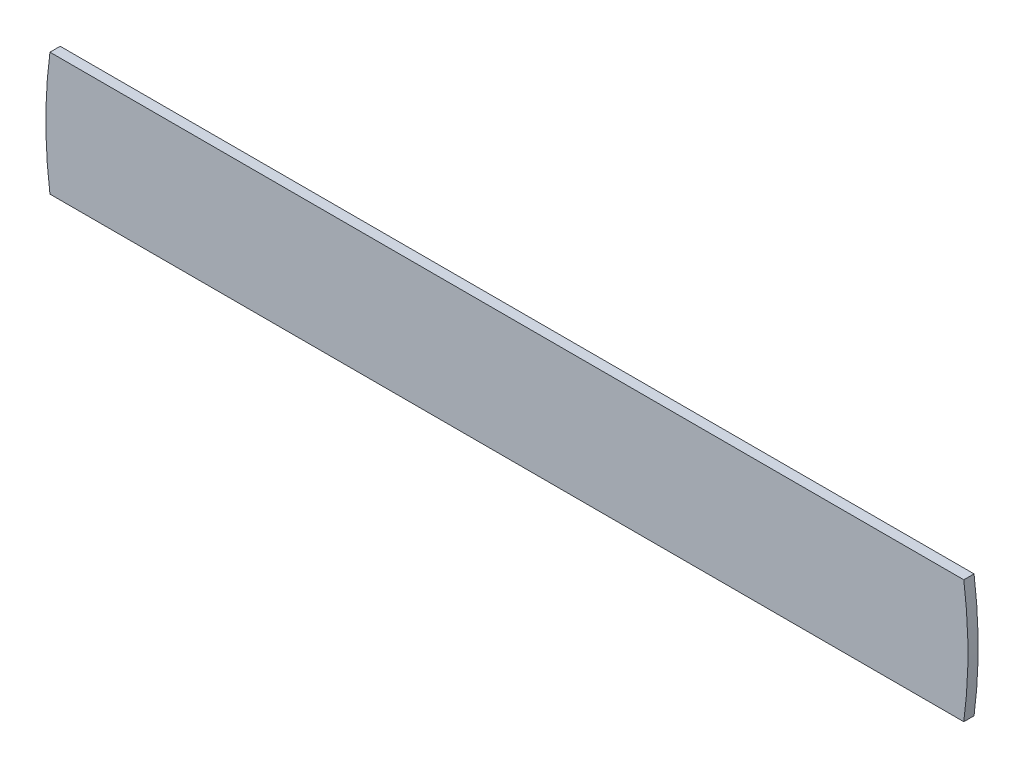
ISO-10303-21;
HEADER;
FILE_DESCRIPTION(('STEP AP214'),'2;1');
FILE_NAME('part.step','',(''),(''),'','','');
FILE_SCHEMA(('AUTOMOTIVE_DESIGN { 1 0 10303 214 1 1 1 1 }'));
ENDSEC;
DATA;
#1=APPLICATION_CONTEXT('core data for automotive mechanical design processes');
#2=APPLICATION_PROTOCOL_DEFINITION('international standard','automotive_design',2000,#1);
#3=PRODUCT_CONTEXT('',#1,'mechanical');
#4=PRODUCT('Part','Part','',(#3));
#5=PRODUCT_RELATED_PRODUCT_CATEGORY('part','',(#4));
#6=PRODUCT_DEFINITION_FORMATION('','',#4);
#7=PRODUCT_DEFINITION_CONTEXT('part definition',#1,'design');
#8=PRODUCT_DEFINITION('design','',#6,#7);
#9=PRODUCT_DEFINITION_SHAPE('','',#8);
#10=(LENGTH_UNIT() NAMED_UNIT(*) SI_UNIT(.MILLI.,.METRE.));
#11=(NAMED_UNIT(*) PLANE_ANGLE_UNIT() SI_UNIT($,.RADIAN.));
#12=(NAMED_UNIT(*) SI_UNIT($,.STERADIAN.) SOLID_ANGLE_UNIT());
#13=UNCERTAINTY_MEASURE_WITH_UNIT(LENGTH_MEASURE(1.E-05),#10,'distance_accuracy_value','');
#14=(GEOMETRIC_REPRESENTATION_CONTEXT(3) GLOBAL_UNCERTAINTY_ASSIGNED_CONTEXT((#13)) GLOBAL_UNIT_ASSIGNED_CONTEXT((#10,
#11,#12)) REPRESENTATION_CONTEXT('',''));
#15=CARTESIAN_POINT('',(0.,0.,0.));
#16=DIRECTION('',(0.,0.,1.));
#17=DIRECTION('',(1.,0.,0.));
#18=AXIS2_PLACEMENT_3D('',#15,#16,#17);
#19=CARTESIAN_POINT('',(0.,0.,-2.));
#20=DIRECTION('',(0.,0.,1.));
#21=DIRECTION('',(1.,0.,0.));
#22=AXIS2_PLACEMENT_3D('',#19,#20,#21);
#23=CYLINDRICAL_SURFACE('',#22,90.);
#24=CARTESIAN_POINT('',(0.,0.,0.));
#25=DIRECTION('',(0.,0.,1.));
#26=DIRECTION('',(1.,0.,0.));
#27=AXIS2_PLACEMENT_3D('',#24,#25,#26);
#28=CIRCLE('',#27,90.);
#29=CARTESIAN_POINT('',(89.196412483911,-12.,0.));
#30=VERTEX_POINT('',#29);
#31=CARTESIAN_POINT('',(89.196412483911,12.,0.));
#32=VERTEX_POINT('',#31);
#33=EDGE_CURVE('E110',#30,#32,#28,.T.);
#34=ORIENTED_EDGE('',*,*,#33,.F.);
#35=DIRECTION('',(0.,0.,1.));
#36=VECTOR('',#35,1.);
#37=CARTESIAN_POINT('',(89.196412483911,-12.,-2.));
#38=LINE('',#37,#36);
#39=CARTESIAN_POINT('',(89.196412483911,-12.,-2.));
#40=VERTEX_POINT('',#39);
#41=EDGE_CURVE('E11',#40,#30,#38,.T.);
#42=ORIENTED_EDGE('',*,*,#41,.F.);
#43=CARTESIAN_POINT('',(0.,0.,-2.));
#44=DIRECTION('',(0.,0.,1.));
#45=DIRECTION('',(1.,0.,0.));
#46=AXIS2_PLACEMENT_3D('',#43,#44,#45);
#47=CIRCLE('',#46,90.);
#48=CARTESIAN_POINT('',(89.196412483911,12.,-2.));
#49=VERTEX_POINT('',#48);
#50=EDGE_CURVE('E102',#40,#49,#47,.T.);
#51=ORIENTED_EDGE('',*,*,#50,.T.);
#52=DIRECTION('',(0.,0.,1.));
#53=VECTOR('',#52,1.);
#54=CARTESIAN_POINT('',(89.196412483911,12.,-2.));
#55=LINE('',#54,#53);
#56=EDGE_CURVE('E46',#49,#32,#55,.T.);
#57=ORIENTED_EDGE('',*,*,#56,.T.);
#58=EDGE_LOOP('',(#34,#42,#51,#57));
#59=FACE_BOUND('',#58,.T.);
#60=ADVANCED_FACE('F43',(#59),#23,.T.);
#61=CARTESIAN_POINT('',(89.196412483911,-12.,-2.));
#62=DIRECTION('',(0.,-1.,0.));
#63=DIRECTION('',(0.,0.,-1.));
#64=AXIS2_PLACEMENT_3D('',#61,#62,#63);
#65=PLANE('',#64);
#66=DIRECTION('',(1.,0.,0.));
#67=VECTOR('',#66,1.);
#68=CARTESIAN_POINT('',(89.196412483911,-12.,0.));
#69=LINE('',#68,#67);
#70=CARTESIAN_POINT('',(-89.196412483911,-12.,0.));
#71=VERTEX_POINT('',#70);
#72=EDGE_CURVE('E104',#71,#30,#69,.T.);
#73=ORIENTED_EDGE('',*,*,#72,.F.);
#74=DIRECTION('',(0.,0.,1.));
#75=VECTOR('',#74,1.);
#76=CARTESIAN_POINT('',(-89.196412483911,-12.,-2.));
#77=LINE('',#76,#75);
#78=CARTESIAN_POINT('',(-89.196412483911,-12.,-2.));
#79=VERTEX_POINT('',#78);
#80=EDGE_CURVE('E55',#79,#71,#77,.T.);
#81=ORIENTED_EDGE('',*,*,#80,.F.);
#82=DIRECTION('',(1.,0.,0.));
#83=VECTOR('',#82,1.);
#84=CARTESIAN_POINT('',(89.196412483911,-12.,-2.));
#85=LINE('',#84,#83);
#86=EDGE_CURVE('E97',#79,#40,#85,.T.);
#87=ORIENTED_EDGE('',*,*,#86,.T.);
#88=ORIENTED_EDGE('',*,*,#41,.T.);
#89=EDGE_LOOP('',(#73,#81,#87,#88));
#90=FACE_BOUND('',#89,.T.);
#91=ADVANCED_FACE('F120',(#90),#65,.T.);
#92=CARTESIAN_POINT('',(0.,0.,-2.));
#93=DIRECTION('',(0.,0.,1.));
#94=DIRECTION('',(1.,0.,0.));
#95=AXIS2_PLACEMENT_3D('',#92,#93,#94);
#96=CYLINDRICAL_SURFACE('',#95,90.);
#97=CARTESIAN_POINT('',(0.,0.,0.));
#98=DIRECTION('',(0.,0.,1.));
#99=DIRECTION('',(1.,0.,0.));
#100=AXIS2_PLACEMENT_3D('',#97,#98,#99);
#101=CIRCLE('',#100,90.);
#102=CARTESIAN_POINT('',(-89.196412483911,12.,0.));
#103=VERTEX_POINT('',#102);
#104=EDGE_CURVE('E93',#103,#71,#101,.T.);
#105=ORIENTED_EDGE('',*,*,#104,.F.);
#106=DIRECTION('',(0.,0.,1.));
#107=VECTOR('',#106,1.);
#108=CARTESIAN_POINT('',(-89.196412483911,12.,-2.));
#109=LINE('',#108,#107);
#110=CARTESIAN_POINT('',(-89.196412483911,12.,-2.));
#111=VERTEX_POINT('',#110);
#112=EDGE_CURVE('E88',#111,#103,#109,.T.);
#113=ORIENTED_EDGE('',*,*,#112,.F.);
#114=CARTESIAN_POINT('',(0.,0.,-2.));
#115=DIRECTION('',(0.,0.,1.));
#116=DIRECTION('',(1.,0.,0.));
#117=AXIS2_PLACEMENT_3D('',#114,#115,#116);
#118=CIRCLE('',#117,90.);
#119=EDGE_CURVE('E91',#111,#79,#118,.T.);
#120=ORIENTED_EDGE('',*,*,#119,.T.);
#121=ORIENTED_EDGE('',*,*,#80,.T.);
#122=EDGE_LOOP('',(#105,#113,#120,#121));
#123=FACE_BOUND('',#122,.T.);
#124=ADVANCED_FACE('F89',(#123),#96,.T.);
#125=CARTESIAN_POINT('',(-89.196412483911,12.,-2.));
#126=DIRECTION('',(0.,1.,0.));
#127=DIRECTION('',(0.,0.,1.));
#128=AXIS2_PLACEMENT_3D('',#125,#126,#127);
#129=PLANE('',#128);
#130=DIRECTION('',(-1.,0.,0.));
#131=VECTOR('',#130,1.);
#132=CARTESIAN_POINT('',(-89.196412483911,12.,0.));
#133=LINE('',#132,#131);
#134=EDGE_CURVE('E109',#32,#103,#133,.T.);
#135=ORIENTED_EDGE('',*,*,#134,.F.);
#136=ORIENTED_EDGE('',*,*,#56,.F.);
#137=DIRECTION('',(-1.,0.,0.));
#138=VECTOR('',#137,1.);
#139=CARTESIAN_POINT('',(-89.196412483911,12.,-2.));
#140=LINE('',#139,#138);
#141=EDGE_CURVE('E100',#49,#111,#140,.T.);
#142=ORIENTED_EDGE('',*,*,#141,.T.);
#143=ORIENTED_EDGE('',*,*,#112,.T.);
#144=EDGE_LOOP('',(#135,#136,#142,#143));
#145=FACE_BOUND('',#144,.T.);
#146=ADVANCED_FACE('F99',(#145),#129,.T.);
#147=CARTESIAN_POINT('',(0.,0.,-2.));
#148=DIRECTION('',(0.,0.,1.));
#149=DIRECTION('',(1.,0.,0.));
#150=AXIS2_PLACEMENT_3D('',#147,#148,#149);
#151=PLANE('',#150);
#152=ORIENTED_EDGE('',*,*,#50,.F.);
#153=ORIENTED_EDGE('',*,*,#86,.F.);
#154=ORIENTED_EDGE('',*,*,#119,.F.);
#155=ORIENTED_EDGE('',*,*,#141,.F.);
#156=EDGE_LOOP('',(#152,#153,#154,#155));
#157=FACE_BOUND('',#156,.T.);
#158=ADVANCED_FACE('F96',(#157),#151,.F.);
#159=CARTESIAN_POINT('',(0.,0.,0.));
#160=DIRECTION('',(0.,0.,1.));
#161=DIRECTION('',(1.,0.,0.));
#162=AXIS2_PLACEMENT_3D('',#159,#160,#161);
#163=PLANE('',#162);
#164=ORIENTED_EDGE('',*,*,#33,.T.);
#165=ORIENTED_EDGE('',*,*,#134,.T.);
#166=ORIENTED_EDGE('',*,*,#104,.T.);
#167=ORIENTED_EDGE('',*,*,#72,.T.);
#168=EDGE_LOOP('',(#164,#165,#166,#167));
#169=FACE_BOUND('',#168,.T.);
#170=ADVANCED_FACE('F118',(#169),#163,.T.);
#171=CLOSED_SHELL('',(#60,#91,#124,#146,#158,#170));
#172=MANIFOLD_SOLID_BREP('B2',#171);
#173=ADVANCED_BREP_SHAPE_REPRESENTATION('',(#18,#172),#14);
#174=SHAPE_DEFINITION_REPRESENTATION(#9,#173);
ENDSEC;
END-ISO-10303-21;
